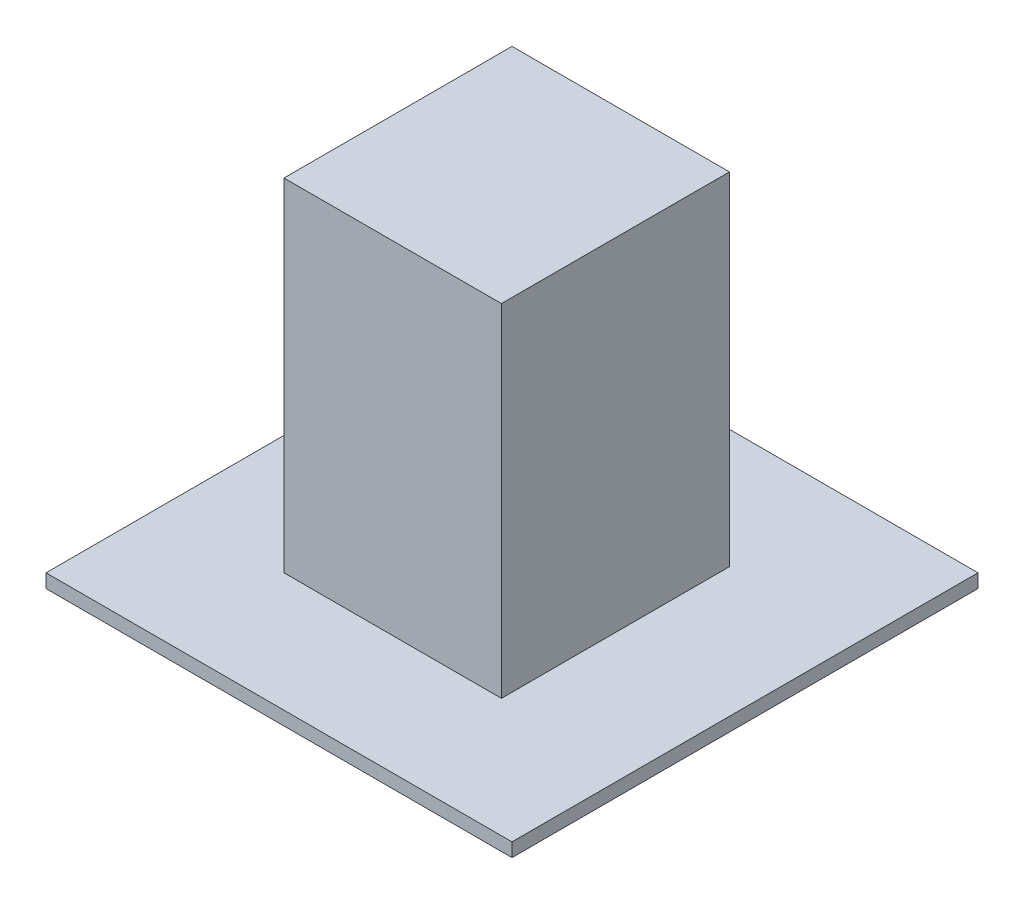
ISO-10303-21;
HEADER;
FILE_DESCRIPTION(('STEP AP214'),'2;1');
FILE_NAME('part.step','',(''),(''),'','','');
FILE_SCHEMA(('AUTOMOTIVE_DESIGN { 1 0 10303 214 1 1 1 1 }'));
ENDSEC;
DATA;
#1=APPLICATION_CONTEXT('core data for automotive mechanical design processes');
#2=APPLICATION_PROTOCOL_DEFINITION('international standard','automotive_design',2000,#1);
#3=PRODUCT_CONTEXT('',#1,'mechanical');
#4=PRODUCT('Part','Part','',(#3));
#5=PRODUCT_RELATED_PRODUCT_CATEGORY('part','',(#4));
#6=PRODUCT_DEFINITION_FORMATION('','',#4);
#7=PRODUCT_DEFINITION_CONTEXT('part definition',#1,'design');
#8=PRODUCT_DEFINITION('design','',#6,#7);
#9=PRODUCT_DEFINITION_SHAPE('','',#8);
#10=(LENGTH_UNIT() NAMED_UNIT(*) SI_UNIT(.MILLI.,.METRE.));
#11=(NAMED_UNIT(*) PLANE_ANGLE_UNIT() SI_UNIT($,.RADIAN.));
#12=(NAMED_UNIT(*) SI_UNIT($,.STERADIAN.) SOLID_ANGLE_UNIT());
#13=UNCERTAINTY_MEASURE_WITH_UNIT(LENGTH_MEASURE(1.E-05),#10,'distance_accuracy_value','');
#14=(GEOMETRIC_REPRESENTATION_CONTEXT(3) GLOBAL_UNCERTAINTY_ASSIGNED_CONTEXT((#13)) GLOBAL_UNIT_ASSIGNED_CONTEXT((#10,
#11,#12)) REPRESENTATION_CONTEXT('',''));
#15=CARTESIAN_POINT('',(0.,0.,0.));
#16=DIRECTION('',(0.,0.,1.));
#17=DIRECTION('',(1.,0.,0.));
#18=AXIS2_PLACEMENT_3D('',#15,#16,#17);
#19=CARTESIAN_POINT('',(0.,4.,0.));
#20=DIRECTION('',(0.,1.,0.));
#21=DIRECTION('',(0.,0.,1.));
#22=AXIS2_PLACEMENT_3D('',#19,#20,#21);
#23=PLANE('',#22);
#24=DIRECTION('',(-1.,0.,0.));
#25=VECTOR('',#24,1.);
#26=CARTESIAN_POINT('',(-68.15,4.,-68.15));
#27=LINE('',#26,#25);
#28=CARTESIAN_POINT('',(68.15,4.,-68.15));
#29=VERTEX_POINT('',#28);
#30=CARTESIAN_POINT('',(-68.15,4.,-68.15));
#31=VERTEX_POINT('',#30);
#32=EDGE_CURVE('E161',#29,#31,#27,.T.);
#33=ORIENTED_EDGE('',*,*,#32,.T.);
#34=DIRECTION('',(0.,0.,1.));
#35=VECTOR('',#34,1.);
#36=CARTESIAN_POINT('',(-68.15,4.,-68.15));
#37=LINE('',#36,#35);
#38=CARTESIAN_POINT('',(-68.15,4.,68.15));
#39=VERTEX_POINT('',#38);
#40=EDGE_CURVE('E166',#31,#39,#37,.T.);
#41=ORIENTED_EDGE('',*,*,#40,.T.);
#42=DIRECTION('',(1.,0.,0.));
#43=VECTOR('',#42,1.);
#44=CARTESIAN_POINT('',(-68.15,4.,68.15));
#45=LINE('',#44,#43);
#46=CARTESIAN_POINT('',(68.15,4.,68.15));
#47=VERTEX_POINT('',#46);
#48=EDGE_CURVE('E168',#39,#47,#45,.T.);
#49=ORIENTED_EDGE('',*,*,#48,.T.);
#50=DIRECTION('',(0.,0.,-1.));
#51=VECTOR('',#50,1.);
#52=CARTESIAN_POINT('',(68.15,4.,-68.15));
#53=LINE('',#52,#51);
#54=EDGE_CURVE('E162',#47,#29,#53,.T.);
#55=ORIENTED_EDGE('',*,*,#54,.T.);
#56=EDGE_LOOP('',(#33,#41,#49,#55));
#57=FACE_BOUND('',#56,.T.);
#58=DIRECTION('',(0.,0.,-1.));
#59=VECTOR('',#58,1.);
#60=CARTESIAN_POINT('',(30.25,4.,-33.35));
#61=LINE('',#60,#59);
#62=CARTESIAN_POINT('',(30.25,4.,33.35));
#63=VERTEX_POINT('',#62);
#64=CARTESIAN_POINT('',(30.25,4.,-33.35));
#65=VERTEX_POINT('',#64);
#66=EDGE_CURVE('E62',#63,#65,#61,.T.);
#67=ORIENTED_EDGE('',*,*,#66,.F.);
#68=DIRECTION('',(1.,0.,0.));
#69=VECTOR('',#68,1.);
#70=CARTESIAN_POINT('',(30.25,4.,33.35));
#71=LINE('',#70,#69);
#72=CARTESIAN_POINT('',(-33.35,4.,33.35));
#73=VERTEX_POINT('',#72);
#74=EDGE_CURVE('E136',#73,#63,#71,.T.);
#75=ORIENTED_EDGE('',*,*,#74,.F.);
#76=DIRECTION('',(0.,0.,1.));
#77=VECTOR('',#76,1.);
#78=CARTESIAN_POINT('',(-33.35,4.,33.35));
#79=LINE('',#78,#77);
#80=CARTESIAN_POINT('',(-33.35,4.,1.55));
#81=VERTEX_POINT('',#80);
#82=EDGE_CURVE('E140',#81,#73,#79,.T.);
#83=ORIENTED_EDGE('',*,*,#82,.F.);
#84=DIRECTION('',(1.,0.,0.));
#85=VECTOR('',#84,1.);
#86=CARTESIAN_POINT('',(-33.35,4.,1.55));
#87=LINE('',#86,#85);
#88=CARTESIAN_POINT('',(-63.85,4.,1.55));
#89=VERTEX_POINT('',#88);
#90=EDGE_CURVE('E130',#89,#81,#87,.T.);
#91=ORIENTED_EDGE('',*,*,#90,.F.);
#92=DIRECTION('',(0.,0.,1.));
#93=VECTOR('',#92,1.);
#94=CARTESIAN_POINT('',(-63.85,4.,-1.54999999999999));
#95=LINE('',#94,#93);
#96=CARTESIAN_POINT('',(-63.85,4.,-1.55));
#97=VERTEX_POINT('',#96);
#98=EDGE_CURVE('E117',#97,#89,#95,.T.);
#99=ORIENTED_EDGE('',*,*,#98,.F.);
#100=DIRECTION('',(-1.,0.,0.));
#101=VECTOR('',#100,1.);
#102=CARTESIAN_POINT('',(-33.35,4.,-1.55));
#103=LINE('',#102,#101);
#104=CARTESIAN_POINT('',(-33.35,4.,-1.55));
#105=VERTEX_POINT('',#104);
#106=EDGE_CURVE('E127',#105,#97,#103,.T.);
#107=ORIENTED_EDGE('',*,*,#106,.F.);
#108=DIRECTION('',(0.,0.,1.));
#109=VECTOR('',#108,1.);
#110=CARTESIAN_POINT('',(-33.35,4.,-1.55));
#111=LINE('',#110,#109);
#112=CARTESIAN_POINT('',(-33.35,4.,-33.35));
#113=VERTEX_POINT('',#112);
#114=EDGE_CURVE('E317',#113,#105,#111,.T.);
#115=ORIENTED_EDGE('',*,*,#114,.F.);
#116=DIRECTION('',(-1.,0.,0.));
#117=VECTOR('',#116,1.);
#118=CARTESIAN_POINT('',(-33.35,4.,-33.35));
#119=LINE('',#118,#117);
#120=EDGE_CURVE('E319',#65,#113,#119,.T.);
#121=ORIENTED_EDGE('',*,*,#120,.F.);
#122=EDGE_LOOP('',(#67,#75,#83,#91,#99,#107,#115,#121));
#123=FACE_BOUND('',#122,.T.);
#124=ADVANCED_FACE('F39',(#57,#123),#23,.T.);
#125=CARTESIAN_POINT('',(-33.35,104.,1.55));
#126=DIRECTION('',(0.,0.,-1.));
#127=DIRECTION('',(-1.,0.,0.));
#128=AXIS2_PLACEMENT_3D('',#125,#126,#127);
#129=PLANE('',#128);
#130=DIRECTION('',(0.409248529410093,0.912422950815945,0.));
#131=VECTOR('',#130,1.);
#132=CARTESIAN_POINT('',(-63.85,4.,1.55));
#133=LINE('',#132,#131);
#134=CARTESIAN_POINT('',(-33.35,72.,1.55));
#135=VERTEX_POINT('',#134);
#136=EDGE_CURVE('E125',#89,#135,#133,.T.);
#137=ORIENTED_EDGE('',*,*,#136,.F.);
#138=ORIENTED_EDGE('',*,*,#90,.T.);
#139=DIRECTION('',(0.,-1.,0.));
#140=VECTOR('',#139,1.);
#141=CARTESIAN_POINT('',(-33.35,104.,1.55));
#142=LINE('',#141,#140);
#143=EDGE_CURVE('E134',#135,#81,#142,.T.);
#144=ORIENTED_EDGE('',*,*,#143,.F.);
#145=EDGE_LOOP('',(#137,#138,#144));
#146=FACE_BOUND('',#145,.T.);
#147=ADVANCED_FACE('F135',(#146),#129,.F.);
#148=CARTESIAN_POINT('',(68.15,4.,-68.15));
#149=DIRECTION('',(-1.,0.,0.));
#150=DIRECTION('',(0.,0.,1.));
#151=AXIS2_PLACEMENT_3D('',#148,#149,#150);
#152=PLANE('',#151);
#153=DIRECTION('',(0.,0.,-1.));
#154=VECTOR('',#153,1.);
#155=CARTESIAN_POINT('',(68.15,0.,-68.15));
#156=LINE('',#155,#154);
#157=CARTESIAN_POINT('',(68.15,0.,68.15));
#158=VERTEX_POINT('',#157);
#159=CARTESIAN_POINT('',(68.15,0.,-68.15));
#160=VERTEX_POINT('',#159);
#161=EDGE_CURVE('E158',#158,#160,#156,.T.);
#162=ORIENTED_EDGE('',*,*,#161,.T.);
#163=DIRECTION('',(0.,-1.,0.));
#164=VECTOR('',#163,1.);
#165=CARTESIAN_POINT('',(68.15,4.,-68.15));
#166=LINE('',#165,#164);
#167=EDGE_CURVE('E50',#29,#160,#166,.T.);
#168=ORIENTED_EDGE('',*,*,#167,.F.);
#169=ORIENTED_EDGE('',*,*,#54,.F.);
#170=DIRECTION('',(0.,-1.,0.));
#171=VECTOR('',#170,1.);
#172=CARTESIAN_POINT('',(68.15,4.,68.15));
#173=LINE('',#172,#171);
#174=EDGE_CURVE('E172',#47,#158,#173,.T.);
#175=ORIENTED_EDGE('',*,*,#174,.T.);
#176=EDGE_LOOP('',(#162,#168,#169,#175));
#177=FACE_BOUND('',#176,.T.);
#178=ADVANCED_FACE('F41',(#177),#152,.F.);
#179=CARTESIAN_POINT('',(-68.15,4.,-68.15));
#180=DIRECTION('',(0.,0.,1.));
#181=DIRECTION('',(1.,0.,0.));
#182=AXIS2_PLACEMENT_3D('',#179,#180,#181);
#183=PLANE('',#182);
#184=DIRECTION('',(-1.,0.,0.));
#185=VECTOR('',#184,1.);
#186=CARTESIAN_POINT('',(-68.15,0.,-68.15));
#187=LINE('',#186,#185);
#188=CARTESIAN_POINT('',(-68.15,0.,-68.15));
#189=VERTEX_POINT('',#188);
#190=EDGE_CURVE('E171',#160,#189,#187,.T.);
#191=ORIENTED_EDGE('',*,*,#190,.T.);
#192=DIRECTION('',(0.,-1.,0.));
#193=VECTOR('',#192,1.);
#194=CARTESIAN_POINT('',(-68.15,4.,-68.15));
#195=LINE('',#194,#193);
#196=EDGE_CURVE('E185',#31,#189,#195,.T.);
#197=ORIENTED_EDGE('',*,*,#196,.F.);
#198=ORIENTED_EDGE('',*,*,#32,.F.);
#199=ORIENTED_EDGE('',*,*,#167,.T.);
#200=EDGE_LOOP('',(#191,#197,#198,#199));
#201=FACE_BOUND('',#200,.T.);
#202=ADVANCED_FACE('F189',(#201),#183,.F.);
#203=CARTESIAN_POINT('',(-68.15,4.,-68.15));
#204=DIRECTION('',(1.,0.,0.));
#205=DIRECTION('',(0.,0.,-1.));
#206=AXIS2_PLACEMENT_3D('',#203,#204,#205);
#207=PLANE('',#206);
#208=DIRECTION('',(0.,0.,1.));
#209=VECTOR('',#208,1.);
#210=CARTESIAN_POINT('',(-68.15,0.,-68.15));
#211=LINE('',#210,#209);
#212=CARTESIAN_POINT('',(-68.15,0.,68.15));
#213=VERTEX_POINT('',#212);
#214=EDGE_CURVE('E177',#189,#213,#211,.T.);
#215=ORIENTED_EDGE('',*,*,#214,.T.);
#216=DIRECTION('',(0.,-1.,0.));
#217=VECTOR('',#216,1.);
#218=CARTESIAN_POINT('',(-68.15,4.,68.15));
#219=LINE('',#218,#217);
#220=EDGE_CURVE('E183',#39,#213,#219,.T.);
#221=ORIENTED_EDGE('',*,*,#220,.F.);
#222=ORIENTED_EDGE('',*,*,#40,.F.);
#223=ORIENTED_EDGE('',*,*,#196,.T.);
#224=EDGE_LOOP('',(#215,#221,#222,#223));
#225=FACE_BOUND('',#224,.T.);
#226=ADVANCED_FACE('F201',(#225),#207,.F.);
#227=CARTESIAN_POINT('',(-68.15,4.,68.15));
#228=DIRECTION('',(0.,0.,-1.));
#229=DIRECTION('',(-1.,0.,0.));
#230=AXIS2_PLACEMENT_3D('',#227,#228,#229);
#231=PLANE('',#230);
#232=DIRECTION('',(1.,0.,0.));
#233=VECTOR('',#232,1.);
#234=CARTESIAN_POINT('',(-68.15,0.,68.15));
#235=LINE('',#234,#233);
#236=EDGE_CURVE('E163',#213,#158,#235,.T.);
#237=ORIENTED_EDGE('',*,*,#236,.T.);
#238=ORIENTED_EDGE('',*,*,#174,.F.);
#239=ORIENTED_EDGE('',*,*,#48,.F.);
#240=ORIENTED_EDGE('',*,*,#220,.T.);
#241=EDGE_LOOP('',(#237,#238,#239,#240));
#242=FACE_BOUND('',#241,.T.);
#243=ADVANCED_FACE('F204',(#242),#231,.F.);
#244=CARTESIAN_POINT('',(0.,0.,0.));
#245=DIRECTION('',(0.,1.,0.));
#246=DIRECTION('',(0.,0.,1.));
#247=AXIS2_PLACEMENT_3D('',#244,#245,#246);
#248=PLANE('',#247);
#249=ORIENTED_EDGE('',*,*,#161,.F.);
#250=ORIENTED_EDGE('',*,*,#236,.F.);
#251=ORIENTED_EDGE('',*,*,#214,.F.);
#252=ORIENTED_EDGE('',*,*,#190,.F.);
#253=EDGE_LOOP('',(#249,#250,#251,#252));
#254=FACE_BOUND('',#253,.T.);
#255=ADVANCED_FACE('F200',(#254),#248,.F.);
#256=CARTESIAN_POINT('',(30.25,104.,-33.35));
#257=DIRECTION('',(-1.,0.,0.));
#258=DIRECTION('',(0.,0.,1.));
#259=AXIS2_PLACEMENT_3D('',#256,#257,#258);
#260=PLANE('',#259);
#261=ORIENTED_EDGE('',*,*,#66,.T.);
#262=DIRECTION('',(0.,-1.,0.));
#263=VECTOR('',#262,1.);
#264=CARTESIAN_POINT('',(30.25,104.,-33.35));
#265=LINE('',#264,#263);
#266=CARTESIAN_POINT('',(30.25,104.,-33.35));
#267=VERTEX_POINT('',#266);
#268=EDGE_CURVE('E160',#267,#65,#265,.T.);
#269=ORIENTED_EDGE('',*,*,#268,.F.);
#270=DIRECTION('',(0.,0.,-1.));
#271=VECTOR('',#270,1.);
#272=CARTESIAN_POINT('',(30.25,104.,-33.35));
#273=LINE('',#272,#271);
#274=CARTESIAN_POINT('',(30.25,104.,33.35));
#275=VERTEX_POINT('',#274);
#276=EDGE_CURVE('E143',#275,#267,#273,.T.);
#277=ORIENTED_EDGE('',*,*,#276,.F.);
#278=DIRECTION('',(0.,-1.,0.));
#279=VECTOR('',#278,1.);
#280=CARTESIAN_POINT('',(30.25,104.,33.35));
#281=LINE('',#280,#279);
#282=EDGE_CURVE('E142',#275,#63,#281,.T.);
#283=ORIENTED_EDGE('',*,*,#282,.T.);
#284=EDGE_LOOP('',(#261,#269,#277,#283));
#285=FACE_BOUND('',#284,.T.);
#286=ADVANCED_FACE('F216',(#285),#260,.F.);
#287=CARTESIAN_POINT('',(-33.35,104.,-33.35));
#288=DIRECTION('',(0.,0.,1.));
#289=DIRECTION('',(1.,0.,0.));
#290=AXIS2_PLACEMENT_3D('',#287,#288,#289);
#291=PLANE('',#290);
#292=ORIENTED_EDGE('',*,*,#120,.T.);
#293=DIRECTION('',(0.,-1.,0.));
#294=VECTOR('',#293,1.);
#295=CARTESIAN_POINT('',(-33.35,104.,-33.35));
#296=LINE('',#295,#294);
#297=CARTESIAN_POINT('',(-33.35,104.,-33.35));
#298=VERTEX_POINT('',#297);
#299=EDGE_CURVE('E153',#298,#113,#296,.T.);
#300=ORIENTED_EDGE('',*,*,#299,.F.);
#301=DIRECTION('',(-1.,0.,0.));
#302=VECTOR('',#301,1.);
#303=CARTESIAN_POINT('',(-33.35,104.,-33.35));
#304=LINE('',#303,#302);
#305=EDGE_CURVE('E333',#267,#298,#304,.T.);
#306=ORIENTED_EDGE('',*,*,#305,.F.);
#307=ORIENTED_EDGE('',*,*,#268,.T.);
#308=EDGE_LOOP('',(#292,#300,#306,#307));
#309=FACE_BOUND('',#308,.T.);
#310=ADVANCED_FACE('F290',(#309),#291,.F.);
#311=CARTESIAN_POINT('',(-33.35,104.,-1.55));
#312=DIRECTION('',(1.,0.,0.));
#313=DIRECTION('',(0.,0.,-1.));
#314=AXIS2_PLACEMENT_3D('',#311,#312,#313);
#315=PLANE('',#314);
#316=ORIENTED_EDGE('',*,*,#299,.T.);
#317=ORIENTED_EDGE('',*,*,#114,.T.);
#318=DIRECTION('',(0.,-1.,0.));
#319=VECTOR('',#318,1.);
#320=CARTESIAN_POINT('',(-33.35,104.,-1.55));
#321=LINE('',#320,#319);
#322=CARTESIAN_POINT('',(-33.35,72.,-1.55));
#323=VERTEX_POINT('',#322);
#324=EDGE_CURVE('E155',#323,#105,#321,.T.);
#325=ORIENTED_EDGE('',*,*,#324,.F.);
#326=DIRECTION('',(0.,0.,1.));
#327=VECTOR('',#326,1.);
#328=CARTESIAN_POINT('',(-33.35,72.,-98.45));
#329=LINE('',#328,#327);
#330=EDGE_CURVE('E53',#323,#135,#329,.T.);
#331=ORIENTED_EDGE('',*,*,#330,.T.);
#332=ORIENTED_EDGE('',*,*,#143,.T.);
#333=ORIENTED_EDGE('',*,*,#82,.T.);
#334=DIRECTION('',(0.,-1.,0.));
#335=VECTOR('',#334,1.);
#336=CARTESIAN_POINT('',(-33.35,104.,33.35));
#337=LINE('',#336,#335);
#338=CARTESIAN_POINT('',(-33.35,104.,33.35));
#339=VERTEX_POINT('',#338);
#340=EDGE_CURVE('E149',#339,#73,#337,.T.);
#341=ORIENTED_EDGE('',*,*,#340,.F.);
#342=DIRECTION('',(0.,0.,1.));
#343=VECTOR('',#342,1.);
#344=CARTESIAN_POINT('',(-33.35,104.,-1.55));
#345=LINE('',#344,#343);
#346=EDGE_CURVE('E330',#298,#339,#345,.T.);
#347=ORIENTED_EDGE('',*,*,#346,.F.);
#348=EDGE_LOOP('',(#316,#317,#325,#331,#332,#333,#341,#347));
#349=FACE_BOUND('',#348,.T.);
#350=ADVANCED_FACE('F306',(#349),#315,.F.);
#351=CARTESIAN_POINT('',(-33.35,104.,-1.55));
#352=DIRECTION('',(0.,0.,1.));
#353=DIRECTION('',(1.,0.,0.));
#354=AXIS2_PLACEMENT_3D('',#351,#352,#353);
#355=PLANE('',#354);
#356=ORIENTED_EDGE('',*,*,#106,.T.);
#357=DIRECTION('',(0.409248529410093,0.912422950815945,0.));
#358=VECTOR('',#357,1.);
#359=CARTESIAN_POINT('',(-21.4009519737138,98.6405005176217,-1.55));
#360=LINE('',#359,#358);
#361=EDGE_CURVE('E11',#97,#323,#360,.T.);
#362=ORIENTED_EDGE('',*,*,#361,.T.);
#363=ORIENTED_EDGE('',*,*,#324,.T.);
#364=EDGE_LOOP('',(#356,#362,#363));
#365=FACE_BOUND('',#364,.T.);
#366=ADVANCED_FACE('F253',(#365),#355,.F.);
#367=CARTESIAN_POINT('',(30.25,104.,33.35));
#368=DIRECTION('',(0.,0.,-1.));
#369=DIRECTION('',(-1.,0.,0.));
#370=AXIS2_PLACEMENT_3D('',#367,#368,#369);
#371=PLANE('',#370);
#372=ORIENTED_EDGE('',*,*,#74,.T.);
#373=ORIENTED_EDGE('',*,*,#282,.F.);
#374=DIRECTION('',(1.,0.,0.));
#375=VECTOR('',#374,1.);
#376=CARTESIAN_POINT('',(30.25,104.,33.35));
#377=LINE('',#376,#375);
#378=EDGE_CURVE('E146',#339,#275,#377,.T.);
#379=ORIENTED_EDGE('',*,*,#378,.F.);
#380=ORIENTED_EDGE('',*,*,#340,.T.);
#381=EDGE_LOOP('',(#372,#373,#379,#380));
#382=FACE_BOUND('',#381,.T.);
#383=ADVANCED_FACE('F252',(#382),#371,.F.);
#384=CARTESIAN_POINT('',(0.,104.,0.));
#385=DIRECTION('',(0.,-1.,0.));
#386=DIRECTION('',(0.,0.,-1.));
#387=AXIS2_PLACEMENT_3D('',#384,#385,#386);
#388=PLANE('',#387);
#389=ORIENTED_EDGE('',*,*,#346,.T.);
#390=ORIENTED_EDGE('',*,*,#378,.T.);
#391=ORIENTED_EDGE('',*,*,#276,.T.);
#392=ORIENTED_EDGE('',*,*,#305,.T.);
#393=EDGE_LOOP('',(#389,#390,#391,#392));
#394=FACE_BOUND('',#393,.T.);
#395=ADVANCED_FACE('F251',(#394),#388,.F.);
#396=CARTESIAN_POINT('',(-63.85,4.,-98.45));
#397=DIRECTION('',(0.912422950815945,-0.409248529410093,0.));
#398=DIRECTION('',(0.409248529410093,0.912422950815945,0.));
#399=AXIS2_PLACEMENT_3D('',#396,#397,#398);
#400=PLANE('',#399);
#401=ORIENTED_EDGE('',*,*,#98,.T.);
#402=ORIENTED_EDGE('',*,*,#136,.T.);
#403=ORIENTED_EDGE('',*,*,#330,.F.);
#404=ORIENTED_EDGE('',*,*,#361,.F.);
#405=EDGE_LOOP('',(#401,#402,#403,#404));
#406=FACE_BOUND('',#405,.T.);
#407=ADVANCED_FACE('F121',(#406),#400,.F.);
#408=CLOSED_SHELL('',(#124,#147,#178,#202,#226,#243,#255,#286,#310,#350,#366,#383,#395,#407));
#409=MANIFOLD_SOLID_BREP('B2',#408);
#410=ADVANCED_BREP_SHAPE_REPRESENTATION('',(#18,#409),#14);
#411=SHAPE_DEFINITION_REPRESENTATION(#9,#410);
ENDSEC;
END-ISO-10303-21;
